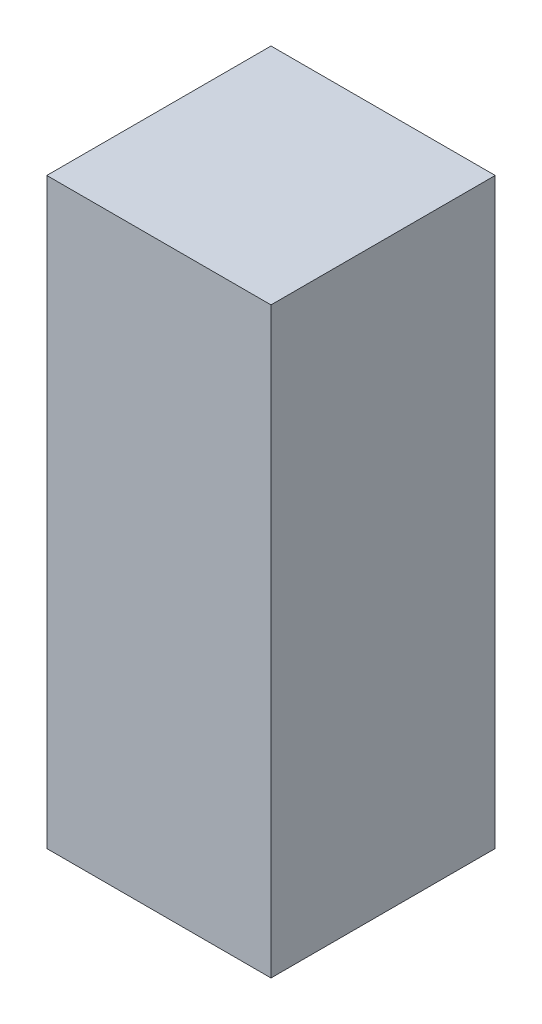
ISO-10303-21;
HEADER;
FILE_DESCRIPTION(('STEP AP214'),'2;1');
FILE_NAME('part.step','',(''),(''),'','','');
FILE_SCHEMA(('AUTOMOTIVE_DESIGN { 1 0 10303 214 1 1 1 1 }'));
ENDSEC;
DATA;
#1=APPLICATION_CONTEXT('core data for automotive mechanical design processes');
#2=APPLICATION_PROTOCOL_DEFINITION('international standard','automotive_design',2000,#1);
#3=PRODUCT_CONTEXT('',#1,'mechanical');
#4=PRODUCT('Part','Part','',(#3));
#5=PRODUCT_RELATED_PRODUCT_CATEGORY('part','',(#4));
#6=PRODUCT_DEFINITION_FORMATION('','',#4);
#7=PRODUCT_DEFINITION_CONTEXT('part definition',#1,'design');
#8=PRODUCT_DEFINITION('design','',#6,#7);
#9=PRODUCT_DEFINITION_SHAPE('','',#8);
#10=(LENGTH_UNIT() NAMED_UNIT(*) SI_UNIT(.MILLI.,.METRE.));
#11=(NAMED_UNIT(*) PLANE_ANGLE_UNIT() SI_UNIT($,.RADIAN.));
#12=(NAMED_UNIT(*) SI_UNIT($,.STERADIAN.) SOLID_ANGLE_UNIT());
#13=UNCERTAINTY_MEASURE_WITH_UNIT(LENGTH_MEASURE(1.E-05),#10,'distance_accuracy_value','');
#14=(GEOMETRIC_REPRESENTATION_CONTEXT(3) GLOBAL_UNCERTAINTY_ASSIGNED_CONTEXT((#13)) GLOBAL_UNIT_ASSIGNED_CONTEXT((#10,
#11,#12)) REPRESENTATION_CONTEXT('',''));
#15=CARTESIAN_POINT('',(0.,0.,0.));
#16=DIRECTION('',(0.,0.,1.));
#17=DIRECTION('',(1.,0.,0.));
#18=AXIS2_PLACEMENT_3D('',#15,#16,#17);
#19=CARTESIAN_POINT('',(-5.,26.,-5.));
#20=DIRECTION('',(1.,0.,0.));
#21=DIRECTION('',(0.,0.,-1.));
#22=AXIS2_PLACEMENT_3D('',#19,#20,#21);
#23=PLANE('',#22);
#24=DIRECTION('',(0.,0.,1.));
#25=VECTOR('',#24,1.);
#26=CARTESIAN_POINT('',(-5.,0.,-5.));
#27=LINE('',#26,#25);
#28=CARTESIAN_POINT('',(-5.,0.,-5.));
#29=VERTEX_POINT('',#28);
#30=CARTESIAN_POINT('',(-5.,0.,5.));
#31=VERTEX_POINT('',#30);
#32=EDGE_CURVE('E107',#29,#31,#27,.T.);
#33=ORIENTED_EDGE('',*,*,#32,.T.);
#34=DIRECTION('',(0.,-1.,0.));
#35=VECTOR('',#34,1.);
#36=CARTESIAN_POINT('',(-5.,26.,5.));
#37=LINE('',#36,#35);
#38=CARTESIAN_POINT('',(-5.,26.,5.));
#39=VERTEX_POINT('',#38);
#40=EDGE_CURVE('E11',#39,#31,#37,.T.);
#41=ORIENTED_EDGE('',*,*,#40,.F.);
#42=DIRECTION('',(0.,0.,1.));
#43=VECTOR('',#42,1.);
#44=CARTESIAN_POINT('',(-5.,26.,-5.));
#45=LINE('',#44,#43);
#46=CARTESIAN_POINT('',(-5.,26.,-5.));
#47=VERTEX_POINT('',#46);
#48=EDGE_CURVE('E92',#47,#39,#45,.T.);
#49=ORIENTED_EDGE('',*,*,#48,.F.);
#50=DIRECTION('',(0.,-1.,0.));
#51=VECTOR('',#50,1.);
#52=CARTESIAN_POINT('',(-5.,26.,-5.));
#53=LINE('',#52,#51);
#54=EDGE_CURVE('E105',#47,#29,#53,.T.);
#55=ORIENTED_EDGE('',*,*,#54,.T.);
#56=EDGE_LOOP('',(#33,#41,#49,#55));
#57=FACE_BOUND('',#56,.T.);
#58=ADVANCED_FACE('F43',(#57),#23,.F.);
#59=CARTESIAN_POINT('',(-5.,26.,5.));
#60=DIRECTION('',(0.,0.,-1.));
#61=DIRECTION('',(-1.,0.,0.));
#62=AXIS2_PLACEMENT_3D('',#59,#60,#61);
#63=PLANE('',#62);
#64=DIRECTION('',(1.,0.,0.));
#65=VECTOR('',#64,1.);
#66=CARTESIAN_POINT('',(-5.,0.,5.));
#67=LINE('',#66,#65);
#68=CARTESIAN_POINT('',(5.,0.,5.));
#69=VERTEX_POINT('',#68);
#70=EDGE_CURVE('E97',#31,#69,#67,.T.);
#71=ORIENTED_EDGE('',*,*,#70,.T.);
#72=DIRECTION('',(0.,-1.,0.));
#73=VECTOR('',#72,1.);
#74=CARTESIAN_POINT('',(5.,26.,5.));
#75=LINE('',#74,#73);
#76=CARTESIAN_POINT('',(5.,26.,5.));
#77=VERTEX_POINT('',#76);
#78=EDGE_CURVE('E51',#77,#69,#75,.T.);
#79=ORIENTED_EDGE('',*,*,#78,.F.);
#80=DIRECTION('',(1.,0.,0.));
#81=VECTOR('',#80,1.);
#82=CARTESIAN_POINT('',(-5.,26.,5.));
#83=LINE('',#82,#81);
#84=EDGE_CURVE('E87',#39,#77,#83,.T.);
#85=ORIENTED_EDGE('',*,*,#84,.F.);
#86=ORIENTED_EDGE('',*,*,#40,.T.);
#87=EDGE_LOOP('',(#71,#79,#85,#86));
#88=FACE_BOUND('',#87,.T.);
#89=ADVANCED_FACE('F100',(#88),#63,.F.);
#90=CARTESIAN_POINT('',(5.,26.,5.));
#91=DIRECTION('',(-1.,0.,0.));
#92=DIRECTION('',(0.,0.,1.));
#93=AXIS2_PLACEMENT_3D('',#90,#91,#92);
#94=PLANE('',#93);
#95=DIRECTION('',(0.,0.,-1.));
#96=VECTOR('',#95,1.);
#97=CARTESIAN_POINT('',(5.,0.,5.));
#98=LINE('',#97,#96);
#99=CARTESIAN_POINT('',(5.,0.,-5.));
#100=VERTEX_POINT('',#99);
#101=EDGE_CURVE('E78',#69,#100,#98,.T.);
#102=ORIENTED_EDGE('',*,*,#101,.T.);
#103=DIRECTION('',(0.,-1.,0.));
#104=VECTOR('',#103,1.);
#105=CARTESIAN_POINT('',(5.,26.,-5.));
#106=LINE('',#105,#104);
#107=CARTESIAN_POINT('',(5.,26.,-5.));
#108=VERTEX_POINT('',#107);
#109=EDGE_CURVE('E98',#108,#100,#106,.T.);
#110=ORIENTED_EDGE('',*,*,#109,.F.);
#111=DIRECTION('',(0.,0.,-1.));
#112=VECTOR('',#111,1.);
#113=CARTESIAN_POINT('',(5.,26.,5.));
#114=LINE('',#113,#112);
#115=EDGE_CURVE('E95',#77,#108,#114,.T.);
#116=ORIENTED_EDGE('',*,*,#115,.F.);
#117=ORIENTED_EDGE('',*,*,#78,.T.);
#118=EDGE_LOOP('',(#102,#110,#116,#117));
#119=FACE_BOUND('',#118,.T.);
#120=ADVANCED_FACE('F99',(#119),#94,.F.);
#121=CARTESIAN_POINT('',(5.,26.,-5.));
#122=DIRECTION('',(0.,0.,1.));
#123=DIRECTION('',(1.,0.,0.));
#124=AXIS2_PLACEMENT_3D('',#121,#122,#123);
#125=PLANE('',#124);
#126=DIRECTION('',(-1.,0.,0.));
#127=VECTOR('',#126,1.);
#128=CARTESIAN_POINT('',(5.,0.,-5.));
#129=LINE('',#128,#127);
#130=EDGE_CURVE('E85',#100,#29,#129,.T.);
#131=ORIENTED_EDGE('',*,*,#130,.T.);
#132=ORIENTED_EDGE('',*,*,#54,.F.);
#133=DIRECTION('',(-1.,0.,0.));
#134=VECTOR('',#133,1.);
#135=CARTESIAN_POINT('',(5.,26.,-5.));
#136=LINE('',#135,#134);
#137=EDGE_CURVE('E56',#108,#47,#136,.T.);
#138=ORIENTED_EDGE('',*,*,#137,.F.);
#139=ORIENTED_EDGE('',*,*,#109,.T.);
#140=EDGE_LOOP('',(#131,#132,#138,#139));
#141=FACE_BOUND('',#140,.T.);
#142=ADVANCED_FACE('F111',(#141),#125,.F.);
#143=CARTESIAN_POINT('',(0.,26.,0.));
#144=DIRECTION('',(0.,1.,0.));
#145=DIRECTION('',(0.,0.,1.));
#146=AXIS2_PLACEMENT_3D('',#143,#144,#145);
#147=PLANE('',#146);
#148=ORIENTED_EDGE('',*,*,#48,.T.);
#149=ORIENTED_EDGE('',*,*,#84,.T.);
#150=ORIENTED_EDGE('',*,*,#115,.T.);
#151=ORIENTED_EDGE('',*,*,#137,.T.);
#152=EDGE_LOOP('',(#148,#149,#150,#151));
#153=FACE_BOUND('',#152,.T.);
#154=ADVANCED_FACE('F89',(#153),#147,.T.);
#155=CARTESIAN_POINT('',(0.,0.,0.));
#156=DIRECTION('',(0.,1.,0.));
#157=DIRECTION('',(0.,0.,1.));
#158=AXIS2_PLACEMENT_3D('',#155,#156,#157);
#159=PLANE('',#158);
#160=ORIENTED_EDGE('',*,*,#32,.F.);
#161=ORIENTED_EDGE('',*,*,#130,.F.);
#162=ORIENTED_EDGE('',*,*,#101,.F.);
#163=ORIENTED_EDGE('',*,*,#70,.F.);
#164=EDGE_LOOP('',(#160,#161,#162,#163));
#165=FACE_BOUND('',#164,.T.);
#166=ADVANCED_FACE('F117',(#165),#159,.F.);
#167=CLOSED_SHELL('',(#58,#89,#120,#142,#154,#166));
#168=MANIFOLD_SOLID_BREP('B2',#167);
#169=ADVANCED_BREP_SHAPE_REPRESENTATION('',(#18,#168),#14);
#170=SHAPE_DEFINITION_REPRESENTATION(#9,#169);
ENDSEC;
END-ISO-10303-21;
